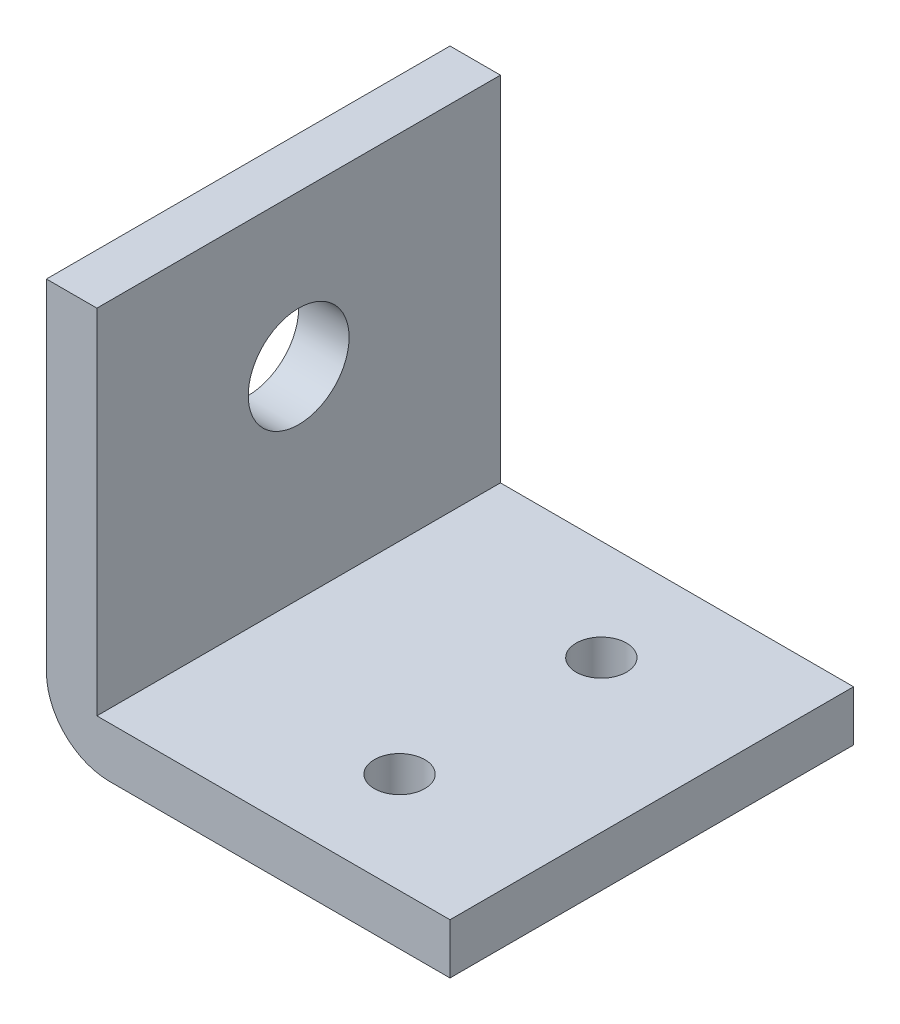
ISO-10303-21;
HEADER;
FILE_DESCRIPTION(('STEP AP214'),'2;1');
FILE_NAME('part.step','',(''),(''),'','','');
FILE_SCHEMA(('AUTOMOTIVE_DESIGN { 1 0 10303 214 1 1 1 1 }'));
ENDSEC;
DATA;
#1=APPLICATION_CONTEXT('core data for automotive mechanical design processes');
#2=APPLICATION_PROTOCOL_DEFINITION('international standard','automotive_design',2000,#1);
#3=PRODUCT_CONTEXT('',#1,'mechanical');
#4=PRODUCT('Part','Part','',(#3));
#5=PRODUCT_RELATED_PRODUCT_CATEGORY('part','',(#4));
#6=PRODUCT_DEFINITION_FORMATION('','',#4);
#7=PRODUCT_DEFINITION_CONTEXT('part definition',#1,'design');
#8=PRODUCT_DEFINITION('design','',#6,#7);
#9=PRODUCT_DEFINITION_SHAPE('','',#8);
#10=(LENGTH_UNIT() NAMED_UNIT(*) SI_UNIT(.MILLI.,.METRE.));
#11=(NAMED_UNIT(*) PLANE_ANGLE_UNIT() SI_UNIT($,.RADIAN.));
#12=(NAMED_UNIT(*) SI_UNIT($,.STERADIAN.) SOLID_ANGLE_UNIT());
#13=UNCERTAINTY_MEASURE_WITH_UNIT(LENGTH_MEASURE(1.E-05),#10,'distance_accuracy_value','');
#14=(GEOMETRIC_REPRESENTATION_CONTEXT(3) GLOBAL_UNCERTAINTY_ASSIGNED_CONTEXT((#13)) GLOBAL_UNIT_ASSIGNED_CONTEXT((#10,
#11,#12)) REPRESENTATION_CONTEXT('',''));
#15=CARTESIAN_POINT('',(0.,0.,0.));
#16=DIRECTION('',(0.,0.,1.));
#17=DIRECTION('',(1.,0.,0.));
#18=AXIS2_PLACEMENT_3D('',#15,#16,#17);
#19=CARTESIAN_POINT('',(0.,40.,20.));
#20=DIRECTION('',(0.,-1.,0.));
#21=DIRECTION('',(0.,0.,-1.));
#22=AXIS2_PLACEMENT_3D('',#19,#20,#21);
#23=PLANE('',#22);
#24=DIRECTION('',(-1.,0.,0.));
#25=VECTOR('',#24,1.);
#26=CARTESIAN_POINT('',(0.,40.,-20.));
#27=LINE('',#26,#25);
#28=CARTESIAN_POINT('',(5.,40.,-20.));
#29=VERTEX_POINT('',#28);
#30=CARTESIAN_POINT('',(0.,40.,-20.));
#31=VERTEX_POINT('',#30);
#32=EDGE_CURVE('E148',#29,#31,#27,.T.);
#33=ORIENTED_EDGE('',*,*,#32,.T.);
#34=DIRECTION('',(0.,0.,-1.));
#35=VECTOR('',#34,1.);
#36=CARTESIAN_POINT('',(0.,40.,20.));
#37=LINE('',#36,#35);
#38=CARTESIAN_POINT('',(0.,40.,20.));
#39=VERTEX_POINT('',#38);
#40=EDGE_CURVE('E12',#39,#31,#37,.T.);
#41=ORIENTED_EDGE('',*,*,#40,.F.);
#42=DIRECTION('',(-1.,0.,0.));
#43=VECTOR('',#42,1.);
#44=CARTESIAN_POINT('',(0.,40.,20.));
#45=LINE('',#44,#43);
#46=CARTESIAN_POINT('',(5.,40.,20.));
#47=VERTEX_POINT('',#46);
#48=EDGE_CURVE('E168',#47,#39,#45,.T.);
#49=ORIENTED_EDGE('',*,*,#48,.F.);
#50=DIRECTION('',(0.,0.,-1.));
#51=VECTOR('',#50,1.);
#52=CARTESIAN_POINT('',(5.,40.,20.));
#53=LINE('',#52,#51);
#54=EDGE_CURVE('E144',#47,#29,#53,.T.);
#55=ORIENTED_EDGE('',*,*,#54,.T.);
#56=EDGE_LOOP('',(#33,#41,#49,#55));
#57=FACE_BOUND('',#56,.T.);
#58=ADVANCED_FACE('F53',(#57),#23,.F.);
#59=CARTESIAN_POINT('',(0.,40.,20.));
#60=DIRECTION('',(1.,0.,0.));
#61=DIRECTION('',(0.,0.,-1.));
#62=AXIS2_PLACEMENT_3D('',#59,#60,#61);
#63=PLANE('',#62);
#64=CARTESIAN_POINT('',(0.,25.,0.));
#65=DIRECTION('',(1.,0.,0.));
#66=DIRECTION('',(0.,0.,-1.));
#67=AXIS2_PLACEMENT_3D('',#64,#65,#66);
#68=CIRCLE('',#67,5.);
#69=CARTESIAN_POINT('',(0.,25.,-5.));
#70=VERTEX_POINT('',#69);
#71=EDGE_CURVE('E212',#70,#70,#68,.T.);
#72=ORIENTED_EDGE('',*,*,#71,.T.);
#73=EDGE_LOOP('',(#72));
#74=FACE_BOUND('',#73,.T.);
#75=DIRECTION('',(0.,-1.,0.));
#76=VECTOR('',#75,1.);
#77=CARTESIAN_POINT('',(0.,40.,-20.));
#78=LINE('',#77,#76);
#79=CARTESIAN_POINT('',(0.,6.25000000000004,-20.));
#80=VERTEX_POINT('',#79);
#81=EDGE_CURVE('E152',#31,#80,#78,.T.);
#82=ORIENTED_EDGE('',*,*,#81,.T.);
#83=DIRECTION('',(0.,0.,-1.));
#84=VECTOR('',#83,1.);
#85=CARTESIAN_POINT('',(0.,6.25000000000004,20.));
#86=LINE('',#85,#84);
#87=CARTESIAN_POINT('',(0.,6.25000000000004,20.));
#88=VERTEX_POINT('',#87);
#89=EDGE_CURVE('E62',#88,#80,#86,.T.);
#90=ORIENTED_EDGE('',*,*,#89,.F.);
#91=DIRECTION('',(0.,-1.,0.));
#92=VECTOR('',#91,1.);
#93=CARTESIAN_POINT('',(0.,40.,20.));
#94=LINE('',#93,#92);
#95=EDGE_CURVE('E110',#39,#88,#94,.T.);
#96=ORIENTED_EDGE('',*,*,#95,.F.);
#97=ORIENTED_EDGE('',*,*,#40,.T.);
#98=EDGE_LOOP('',(#82,#90,#96,#97));
#99=FACE_BOUND('',#98,.T.);
#100=ADVANCED_FACE('F238',(#74,#99),#63,.F.);
#101=CARTESIAN_POINT('',(6.25,6.25,20.));
#102=DIRECTION('',(0.,0.,-1.));
#103=DIRECTION('',(-1.,0.,0.));
#104=AXIS2_PLACEMENT_3D('',#101,#102,#103);
#105=CYLINDRICAL_SURFACE('',#104,6.25);
#106=CARTESIAN_POINT('',(6.25,6.25,-20.));
#107=DIRECTION('',(0.,0.,1.));
#108=DIRECTION('',(-1.,0.,0.));
#109=AXIS2_PLACEMENT_3D('',#106,#107,#108);
#110=CIRCLE('',#109,6.25);
#111=CARTESIAN_POINT('',(6.25000000000005,0.,-20.));
#112=VERTEX_POINT('',#111);
#113=EDGE_CURVE('E156',#80,#112,#110,.T.);
#114=ORIENTED_EDGE('',*,*,#113,.T.);
#115=DIRECTION('',(0.,0.,-1.));
#116=VECTOR('',#115,1.);
#117=CARTESIAN_POINT('',(6.25000000000005,0.,20.));
#118=LINE('',#117,#116);
#119=CARTESIAN_POINT('',(6.25000000000005,0.,20.));
#120=VERTEX_POINT('',#119);
#121=EDGE_CURVE('E175',#120,#112,#118,.T.);
#122=ORIENTED_EDGE('',*,*,#121,.F.);
#123=CARTESIAN_POINT('',(6.25,6.25,20.));
#124=DIRECTION('',(0.,0.,1.));
#125=DIRECTION('',(-1.,0.,0.));
#126=AXIS2_PLACEMENT_3D('',#123,#124,#125);
#127=CIRCLE('',#126,6.25);
#128=EDGE_CURVE('E185',#88,#120,#127,.T.);
#129=ORIENTED_EDGE('',*,*,#128,.F.);
#130=ORIENTED_EDGE('',*,*,#89,.T.);
#131=EDGE_LOOP('',(#114,#122,#129,#130));
#132=FACE_BOUND('',#131,.T.);
#133=ADVANCED_FACE('F183',(#132),#105,.T.);
#134=CARTESIAN_POINT('',(6.25000000000004,0.,20.));
#135=DIRECTION('',(0.,1.,0.));
#136=DIRECTION('',(0.,0.,1.));
#137=AXIS2_PLACEMENT_3D('',#134,#135,#136);
#138=PLANE('',#137);
#139=CARTESIAN_POINT('',(25.,0.,10.));
#140=DIRECTION('',(0.,1.,0.));
#141=DIRECTION('',(0.,0.,1.));
#142=AXIS2_PLACEMENT_3D('',#139,#140,#141);
#143=CIRCLE('',#142,2.5);
#144=CARTESIAN_POINT('',(25.,0.,12.5));
#145=VERTEX_POINT('',#144);
#146=EDGE_CURVE('E153',#145,#145,#143,.T.);
#147=ORIENTED_EDGE('',*,*,#146,.T.);
#148=EDGE_LOOP('',(#147));
#149=FACE_BOUND('',#148,.T.);
#150=CARTESIAN_POINT('',(25.,0.,-10.));
#151=DIRECTION('',(0.,1.,0.));
#152=DIRECTION('',(0.,0.,1.));
#153=AXIS2_PLACEMENT_3D('',#150,#151,#152);
#154=CIRCLE('',#153,2.5);
#155=CARTESIAN_POINT('',(25.,0.,-7.5));
#156=VERTEX_POINT('',#155);
#157=EDGE_CURVE('E203',#156,#156,#154,.T.);
#158=ORIENTED_EDGE('',*,*,#157,.T.);
#159=EDGE_LOOP('',(#158));
#160=FACE_BOUND('',#159,.T.);
#161=DIRECTION('',(1.,0.,0.));
#162=VECTOR('',#161,1.);
#163=CARTESIAN_POINT('',(6.25000000000004,0.,-20.));
#164=LINE('',#163,#162);
#165=CARTESIAN_POINT('',(40.,0.,-20.));
#166=VERTEX_POINT('',#165);
#167=EDGE_CURVE('E159',#112,#166,#164,.T.);
#168=ORIENTED_EDGE('',*,*,#167,.T.);
#169=DIRECTION('',(0.,0.,-1.));
#170=VECTOR('',#169,1.);
#171=CARTESIAN_POINT('',(40.,0.,20.));
#172=LINE('',#171,#170);
#173=CARTESIAN_POINT('',(40.,0.,20.));
#174=VERTEX_POINT('',#173);
#175=EDGE_CURVE('E137',#174,#166,#172,.T.);
#176=ORIENTED_EDGE('',*,*,#175,.F.);
#177=DIRECTION('',(1.,0.,0.));
#178=VECTOR('',#177,1.);
#179=CARTESIAN_POINT('',(6.25000000000004,0.,20.));
#180=LINE('',#179,#178);
#181=EDGE_CURVE('E126',#120,#174,#180,.T.);
#182=ORIENTED_EDGE('',*,*,#181,.F.);
#183=ORIENTED_EDGE('',*,*,#121,.T.);
#184=EDGE_LOOP('',(#168,#176,#182,#183));
#185=FACE_BOUND('',#184,.T.);
#186=ADVANCED_FACE('F191',(#149,#160,#185),#138,.F.);
#187=CARTESIAN_POINT('',(40.,0.,20.));
#188=DIRECTION('',(-1.,0.,0.));
#189=DIRECTION('',(0.,0.,1.));
#190=AXIS2_PLACEMENT_3D('',#187,#188,#189);
#191=PLANE('',#190);
#192=DIRECTION('',(0.,1.,0.));
#193=VECTOR('',#192,1.);
#194=CARTESIAN_POINT('',(40.,0.,-20.));
#195=LINE('',#194,#193);
#196=CARTESIAN_POINT('',(40.,5.,-20.));
#197=VERTEX_POINT('',#196);
#198=EDGE_CURVE('E135',#166,#197,#195,.T.);
#199=ORIENTED_EDGE('',*,*,#198,.T.);
#200=DIRECTION('',(0.,0.,-1.));
#201=VECTOR('',#200,1.);
#202=CARTESIAN_POINT('',(40.,5.,20.));
#203=LINE('',#202,#201);
#204=CARTESIAN_POINT('',(40.,5.,20.));
#205=VERTEX_POINT('',#204);
#206=EDGE_CURVE('E132',#205,#197,#203,.T.);
#207=ORIENTED_EDGE('',*,*,#206,.F.);
#208=DIRECTION('',(0.,1.,0.));
#209=VECTOR('',#208,1.);
#210=CARTESIAN_POINT('',(40.,0.,20.));
#211=LINE('',#210,#209);
#212=EDGE_CURVE('E120',#174,#205,#211,.T.);
#213=ORIENTED_EDGE('',*,*,#212,.F.);
#214=ORIENTED_EDGE('',*,*,#175,.T.);
#215=EDGE_LOOP('',(#199,#207,#213,#214));
#216=FACE_BOUND('',#215,.T.);
#217=ADVANCED_FACE('F133',(#216),#191,.F.);
#218=CARTESIAN_POINT('',(5.,5.,20.));
#219=DIRECTION('',(0.,-1.,0.));
#220=DIRECTION('',(0.,0.,-1.));
#221=AXIS2_PLACEMENT_3D('',#218,#219,#220);
#222=PLANE('',#221);
#223=CARTESIAN_POINT('',(25.,5.,10.));
#224=DIRECTION('',(0.,1.,0.));
#225=DIRECTION('',(0.,0.,1.));
#226=AXIS2_PLACEMENT_3D('',#223,#224,#225);
#227=CIRCLE('',#226,2.5);
#228=CARTESIAN_POINT('',(25.,5.,12.5));
#229=VERTEX_POINT('',#228);
#230=EDGE_CURVE('E207',#229,#229,#227,.T.);
#231=ORIENTED_EDGE('',*,*,#230,.F.);
#232=EDGE_LOOP('',(#231));
#233=FACE_BOUND('',#232,.T.);
#234=CARTESIAN_POINT('',(25.,5.,-10.));
#235=DIRECTION('',(0.,1.,0.));
#236=DIRECTION('',(0.,0.,1.));
#237=AXIS2_PLACEMENT_3D('',#234,#235,#236);
#238=CIRCLE('',#237,2.5);
#239=CARTESIAN_POINT('',(25.,5.,-7.5));
#240=VERTEX_POINT('',#239);
#241=EDGE_CURVE('E208',#240,#240,#238,.T.);
#242=ORIENTED_EDGE('',*,*,#241,.F.);
#243=EDGE_LOOP('',(#242));
#244=FACE_BOUND('',#243,.T.);
#245=DIRECTION('',(-1.,0.,0.));
#246=VECTOR('',#245,1.);
#247=CARTESIAN_POINT('',(5.,5.,-20.));
#248=LINE('',#247,#246);
#249=CARTESIAN_POINT('',(5.,5.,-20.));
#250=VERTEX_POINT('',#249);
#251=EDGE_CURVE('E96',#197,#250,#248,.T.);
#252=ORIENTED_EDGE('',*,*,#251,.T.);
#253=DIRECTION('',(0.,0.,-1.));
#254=VECTOR('',#253,1.);
#255=CARTESIAN_POINT('',(5.,5.,20.));
#256=LINE('',#255,#254);
#257=CARTESIAN_POINT('',(5.,5.,20.));
#258=VERTEX_POINT('',#257);
#259=EDGE_CURVE('E138',#258,#250,#256,.T.);
#260=ORIENTED_EDGE('',*,*,#259,.F.);
#261=DIRECTION('',(-1.,0.,0.));
#262=VECTOR('',#261,1.);
#263=CARTESIAN_POINT('',(5.,5.,20.));
#264=LINE('',#263,#262);
#265=EDGE_CURVE('E124',#205,#258,#264,.T.);
#266=ORIENTED_EDGE('',*,*,#265,.F.);
#267=ORIENTED_EDGE('',*,*,#206,.T.);
#268=EDGE_LOOP('',(#252,#260,#266,#267));
#269=FACE_BOUND('',#268,.T.);
#270=ADVANCED_FACE('F140',(#233,#244,#269),#222,.F.);
#271=CARTESIAN_POINT('',(5.,40.,20.));
#272=DIRECTION('',(-1.,0.,0.));
#273=DIRECTION('',(0.,0.,1.));
#274=AXIS2_PLACEMENT_3D('',#271,#272,#273);
#275=PLANE('',#274);
#276=CARTESIAN_POINT('',(5.,25.,0.));
#277=DIRECTION('',(1.,0.,0.));
#278=DIRECTION('',(0.,0.,-1.));
#279=AXIS2_PLACEMENT_3D('',#276,#277,#278);
#280=CIRCLE('',#279,5.);
#281=CARTESIAN_POINT('',(5.,25.,-5.));
#282=VERTEX_POINT('',#281);
#283=EDGE_CURVE('E219',#282,#282,#280,.T.);
#284=ORIENTED_EDGE('',*,*,#283,.F.);
#285=EDGE_LOOP('',(#284));
#286=FACE_BOUND('',#285,.T.);
#287=DIRECTION('',(0.,1.,0.));
#288=VECTOR('',#287,1.);
#289=CARTESIAN_POINT('',(5.,40.,-20.));
#290=LINE('',#289,#288);
#291=EDGE_CURVE('E102',#250,#29,#290,.T.);
#292=ORIENTED_EDGE('',*,*,#291,.T.);
#293=ORIENTED_EDGE('',*,*,#54,.F.);
#294=DIRECTION('',(0.,1.,0.));
#295=VECTOR('',#294,1.);
#296=CARTESIAN_POINT('',(5.,40.,20.));
#297=LINE('',#296,#295);
#298=EDGE_CURVE('E70',#258,#47,#297,.T.);
#299=ORIENTED_EDGE('',*,*,#298,.F.);
#300=ORIENTED_EDGE('',*,*,#259,.T.);
#301=EDGE_LOOP('',(#292,#293,#299,#300));
#302=FACE_BOUND('',#301,.T.);
#303=ADVANCED_FACE('F227',(#286,#302),#275,.F.);
#304=CARTESIAN_POINT('',(6.25,6.25,20.));
#305=DIRECTION('',(0.,0.,-1.));
#306=DIRECTION('',(-1.,0.,0.));
#307=AXIS2_PLACEMENT_3D('',#304,#305,#306);
#308=PLANE('',#307);
#309=ORIENTED_EDGE('',*,*,#48,.T.);
#310=ORIENTED_EDGE('',*,*,#95,.T.);
#311=ORIENTED_EDGE('',*,*,#128,.T.);
#312=ORIENTED_EDGE('',*,*,#181,.T.);
#313=ORIENTED_EDGE('',*,*,#212,.T.);
#314=ORIENTED_EDGE('',*,*,#265,.T.);
#315=ORIENTED_EDGE('',*,*,#298,.T.);
#316=EDGE_LOOP('',(#309,#310,#311,#312,#313,#314,#315));
#317=FACE_BOUND('',#316,.T.);
#318=ADVANCED_FACE('F122',(#317),#308,.F.);
#319=CARTESIAN_POINT('',(6.25,6.25,-20.));
#320=DIRECTION('',(0.,0.,-1.));
#321=DIRECTION('',(-1.,0.,0.));
#322=AXIS2_PLACEMENT_3D('',#319,#320,#321);
#323=PLANE('',#322);
#324=ORIENTED_EDGE('',*,*,#32,.F.);
#325=ORIENTED_EDGE('',*,*,#291,.F.);
#326=ORIENTED_EDGE('',*,*,#251,.F.);
#327=ORIENTED_EDGE('',*,*,#198,.F.);
#328=ORIENTED_EDGE('',*,*,#167,.F.);
#329=ORIENTED_EDGE('',*,*,#113,.F.);
#330=ORIENTED_EDGE('',*,*,#81,.F.);
#331=EDGE_LOOP('',(#324,#325,#326,#327,#328,#329,#330));
#332=FACE_BOUND('',#331,.T.);
#333=ADVANCED_FACE('F189',(#332),#323,.T.);
#334=CARTESIAN_POINT('',(25.,-35.,-10.));
#335=DIRECTION('',(0.,1.,0.));
#336=DIRECTION('',(0.,0.,1.));
#337=AXIS2_PLACEMENT_3D('',#334,#335,#336);
#338=CYLINDRICAL_SURFACE('',#337,2.5);
#339=ORIENTED_EDGE('',*,*,#241,.T.);
#340=EDGE_LOOP('',(#339));
#341=FACE_BOUND('',#340,.T.);
#342=ORIENTED_EDGE('',*,*,#157,.F.);
#343=EDGE_LOOP('',(#342));
#344=FACE_BOUND('',#343,.T.);
#345=ADVANCED_FACE('F304',(#341,#344),#338,.F.);
#346=CARTESIAN_POINT('',(25.,-35.,10.));
#347=DIRECTION('',(0.,1.,0.));
#348=DIRECTION('',(0.,0.,1.));
#349=AXIS2_PLACEMENT_3D('',#346,#347,#348);
#350=CYLINDRICAL_SURFACE('',#349,2.5);
#351=ORIENTED_EDGE('',*,*,#230,.T.);
#352=EDGE_LOOP('',(#351));
#353=FACE_BOUND('',#352,.T.);
#354=ORIENTED_EDGE('',*,*,#146,.F.);
#355=EDGE_LOOP('',(#354));
#356=FACE_BOUND('',#355,.T.);
#357=ADVANCED_FACE('F281',(#353,#356),#350,.F.);
#358=CARTESIAN_POINT('',(-35.,25.,0.));
#359=DIRECTION('',(1.,0.,0.));
#360=DIRECTION('',(0.,0.,-1.));
#361=AXIS2_PLACEMENT_3D('',#358,#359,#360);
#362=CYLINDRICAL_SURFACE('',#361,5.);
#363=ORIENTED_EDGE('',*,*,#283,.T.);
#364=EDGE_LOOP('',(#363));
#365=FACE_BOUND('',#364,.T.);
#366=ORIENTED_EDGE('',*,*,#71,.F.);
#367=EDGE_LOOP('',(#366));
#368=FACE_BOUND('',#367,.T.);
#369=ADVANCED_FACE('F224',(#365,#368),#362,.F.);
#370=CLOSED_SHELL('',(#58,#100,#133,#186,#217,#270,#303,#318,#333,#345,#357,#369));
#371=MANIFOLD_SOLID_BREP('B2',#370);
#372=ADVANCED_BREP_SHAPE_REPRESENTATION('',(#18,#371),#14);
#373=SHAPE_DEFINITION_REPRESENTATION(#9,#372);
ENDSEC;
END-ISO-10303-21;
